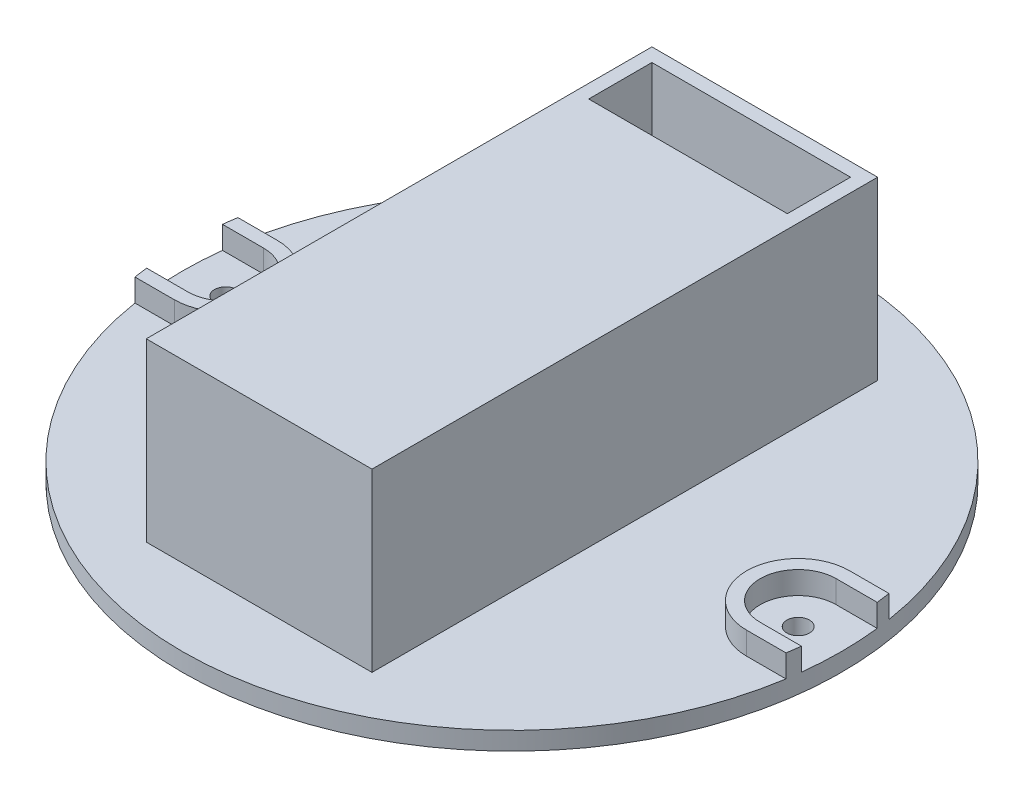
ISO-10303-21;
HEADER;
FILE_DESCRIPTION(('STEP AP214'),'2;1');
FILE_NAME('part.step','',(''),(''),'','','');
FILE_SCHEMA(('AUTOMOTIVE_DESIGN { 1 0 10303 214 1 1 1 1 }'));
ENDSEC;
DATA;
#1=APPLICATION_CONTEXT('core data for automotive mechanical design processes');
#2=APPLICATION_PROTOCOL_DEFINITION('international standard','automotive_design',2000,#1);
#3=PRODUCT_CONTEXT('',#1,'mechanical');
#4=PRODUCT('Part','Part','',(#3));
#5=PRODUCT_RELATED_PRODUCT_CATEGORY('part','',(#4));
#6=PRODUCT_DEFINITION_FORMATION('','',#4);
#7=PRODUCT_DEFINITION_CONTEXT('part definition',#1,'design');
#8=PRODUCT_DEFINITION('design','',#6,#7);
#9=PRODUCT_DEFINITION_SHAPE('','',#8);
#10=(LENGTH_UNIT() NAMED_UNIT(*) SI_UNIT(.MILLI.,.METRE.));
#11=(NAMED_UNIT(*) PLANE_ANGLE_UNIT() SI_UNIT($,.RADIAN.));
#12=(NAMED_UNIT(*) SI_UNIT($,.STERADIAN.) SOLID_ANGLE_UNIT());
#13=UNCERTAINTY_MEASURE_WITH_UNIT(LENGTH_MEASURE(1.E-05),#10,'distance_accuracy_value','');
#14=(GEOMETRIC_REPRESENTATION_CONTEXT(3) GLOBAL_UNCERTAINTY_ASSIGNED_CONTEXT((#13)) GLOBAL_UNIT_ASSIGNED_CONTEXT((#10,
#11,#12)) REPRESENTATION_CONTEXT('',''));
#15=CARTESIAN_POINT('',(0.,0.,0.));
#16=DIRECTION('',(0.,0.,1.));
#17=DIRECTION('',(1.,0.,0.));
#18=AXIS2_PLACEMENT_3D('',#15,#16,#17);
#19=CARTESIAN_POINT('',(0.,-70.5,-26.5));
#20=DIRECTION('',(0.,0.,-1.));
#21=DIRECTION('',(-1.,0.,0.));
#22=AXIS2_PLACEMENT_3D('',#19,#20,#21);
#23=PLANE('',#22);
#24=DIRECTION('',(0.,-1.,0.));
#25=VECTOR('',#24,1.);
#26=CARTESIAN_POINT('',(11.,-70.5,-26.5));
#27=LINE('',#26,#25);
#28=CARTESIAN_POINT('',(11.,-70.5,-26.5));
#29=VERTEX_POINT('',#28);
#30=CARTESIAN_POINT('',(11.,-92.,-26.5));
#31=VERTEX_POINT('',#30);
#32=EDGE_CURVE('E209',#29,#31,#27,.T.);
#33=ORIENTED_EDGE('',*,*,#32,.F.);
#34=DIRECTION('',(1.,0.,0.));
#35=VECTOR('',#34,1.);
#36=CARTESIAN_POINT('',(-11.,-70.5,-26.5));
#37=LINE('',#36,#35);
#38=CARTESIAN_POINT('',(-11.,-70.5,-26.5));
#39=VERTEX_POINT('',#38);
#40=EDGE_CURVE('E211',#39,#29,#37,.T.);
#41=ORIENTED_EDGE('',*,*,#40,.F.);
#42=DIRECTION('',(0.,-1.,0.));
#43=VECTOR('',#42,1.);
#44=CARTESIAN_POINT('',(-11.,-70.5,-26.5));
#45=LINE('',#44,#43);
#46=CARTESIAN_POINT('',(-11.,-92.,-26.5));
#47=VERTEX_POINT('',#46);
#48=EDGE_CURVE('E217',#39,#47,#45,.T.);
#49=ORIENTED_EDGE('',*,*,#48,.T.);
#50=DIRECTION('',(1.,0.,0.));
#51=VECTOR('',#50,1.);
#52=CARTESIAN_POINT('',(-11.,-92.,-26.5));
#53=LINE('',#52,#51);
#54=EDGE_CURVE('E214',#47,#31,#53,.T.);
#55=ORIENTED_EDGE('',*,*,#54,.T.);
#56=EDGE_LOOP('',(#33,#41,#49,#55));
#57=FACE_BOUND('',#56,.T.);
#58=ADVANCED_FACE('F35',(#57),#23,.F.);
#59=CARTESIAN_POINT('',(-11.,-70.5,0.));
#60=DIRECTION('',(-1.,0.,0.));
#61=DIRECTION('',(0.,0.,1.));
#62=AXIS2_PLACEMENT_3D('',#59,#60,#61);
#63=PLANE('',#62);
#64=ORIENTED_EDGE('',*,*,#48,.F.);
#65=DIRECTION('',(0.,0.,-1.));
#66=VECTOR('',#65,1.);
#67=CARTESIAN_POINT('',(-11.,-70.5,-26.5));
#68=LINE('',#67,#66);
#69=CARTESIAN_POINT('',(-11.,-70.5,-19.5));
#70=VERTEX_POINT('',#69);
#71=EDGE_CURVE('E230',#70,#39,#68,.T.);
#72=ORIENTED_EDGE('',*,*,#71,.F.);
#73=DIRECTION('',(0.,-1.,0.));
#74=VECTOR('',#73,1.);
#75=CARTESIAN_POINT('',(-11.,25.501,-19.5));
#76=LINE('',#75,#74);
#77=CARTESIAN_POINT('',(-11.,-72.,-19.5));
#78=VERTEX_POINT('',#77);
#79=EDGE_CURVE('E226',#70,#78,#76,.T.);
#80=ORIENTED_EDGE('',*,*,#79,.T.);
#81=DIRECTION('',(0.,0.,1.));
#82=VECTOR('',#81,1.);
#83=CARTESIAN_POINT('',(-11.,-72.,0.));
#84=LINE('',#83,#82);
#85=CARTESIAN_POINT('',(-11.,-72.,26.5));
#86=VERTEX_POINT('',#85);
#87=EDGE_CURVE('E248',#78,#86,#84,.T.);
#88=ORIENTED_EDGE('',*,*,#87,.T.);
#89=DIRECTION('',(0.,-1.,0.));
#90=VECTOR('',#89,1.);
#91=CARTESIAN_POINT('',(-11.,-70.5,26.5));
#92=LINE('',#91,#90);
#93=CARTESIAN_POINT('',(-11.,-92.,26.5));
#94=VERTEX_POINT('',#93);
#95=EDGE_CURVE('E288',#86,#94,#92,.T.);
#96=ORIENTED_EDGE('',*,*,#95,.T.);
#97=DIRECTION('',(0.,0.,-1.));
#98=VECTOR('',#97,1.);
#99=CARTESIAN_POINT('',(-11.,-92.,26.5));
#100=LINE('',#99,#98);
#101=EDGE_CURVE('E245',#94,#47,#100,.T.);
#102=ORIENTED_EDGE('',*,*,#101,.T.);
#103=EDGE_LOOP('',(#64,#72,#80,#88,#96,#102));
#104=FACE_BOUND('',#103,.T.);
#105=ADVANCED_FACE('F485',(#104),#63,.F.);
#106=CARTESIAN_POINT('',(0.,-70.5,26.5));
#107=DIRECTION('',(0.,0.,-1.));
#108=DIRECTION('',(-1.,0.,0.));
#109=AXIS2_PLACEMENT_3D('',#106,#107,#108);
#110=PLANE('',#109);
#111=DIRECTION('',(-1.,0.,0.));
#112=VECTOR('',#111,1.);
#113=CARTESIAN_POINT('',(0.,-72.,26.5));
#114=LINE('',#113,#112);
#115=CARTESIAN_POINT('',(11.,-72.,26.5));
#116=VERTEX_POINT('',#115);
#117=EDGE_CURVE('E250',#116,#86,#114,.T.);
#118=ORIENTED_EDGE('',*,*,#117,.F.);
#119=DIRECTION('',(0.,-1.,0.));
#120=VECTOR('',#119,1.);
#121=CARTESIAN_POINT('',(11.,-70.5,26.5));
#122=LINE('',#121,#120);
#123=CARTESIAN_POINT('',(11.,-92.,26.5));
#124=VERTEX_POINT('',#123);
#125=EDGE_CURVE('E280',#116,#124,#122,.T.);
#126=ORIENTED_EDGE('',*,*,#125,.T.);
#127=DIRECTION('',(1.,0.,0.));
#128=VECTOR('',#127,1.);
#129=CARTESIAN_POINT('',(-11.,-92.,26.5));
#130=LINE('',#129,#128);
#131=EDGE_CURVE('E225',#94,#124,#130,.T.);
#132=ORIENTED_EDGE('',*,*,#131,.F.);
#133=ORIENTED_EDGE('',*,*,#95,.F.);
#134=EDGE_LOOP('',(#118,#126,#132,#133));
#135=FACE_BOUND('',#134,.T.);
#136=ADVANCED_FACE('F490',(#135),#110,.T.);
#137=CARTESIAN_POINT('',(11.,-70.5,0.));
#138=DIRECTION('',(-1.,0.,0.));
#139=DIRECTION('',(0.,0.,1.));
#140=AXIS2_PLACEMENT_3D('',#137,#138,#139);
#141=PLANE('',#140);
#142=DIRECTION('',(0.,0.,1.));
#143=VECTOR('',#142,1.);
#144=CARTESIAN_POINT('',(11.,-72.,0.));
#145=LINE('',#144,#143);
#146=CARTESIAN_POINT('',(11.,-72.,-19.5));
#147=VERTEX_POINT('',#146);
#148=EDGE_CURVE('E253',#147,#116,#145,.T.);
#149=ORIENTED_EDGE('',*,*,#148,.F.);
#150=DIRECTION('',(0.,-1.,0.));
#151=VECTOR('',#150,1.);
#152=CARTESIAN_POINT('',(11.,25.501,-19.5));
#153=LINE('',#152,#151);
#154=CARTESIAN_POINT('',(11.,-70.5,-19.5));
#155=VERTEX_POINT('',#154);
#156=EDGE_CURVE('E51',#155,#147,#153,.T.);
#157=ORIENTED_EDGE('',*,*,#156,.F.);
#158=DIRECTION('',(0.,0.,1.));
#159=VECTOR('',#158,1.);
#160=CARTESIAN_POINT('',(11.,-70.5,-26.5));
#161=LINE('',#160,#159);
#162=EDGE_CURVE('E221',#29,#155,#161,.T.);
#163=ORIENTED_EDGE('',*,*,#162,.F.);
#164=ORIENTED_EDGE('',*,*,#32,.T.);
#165=DIRECTION('',(0.,0.,-1.));
#166=VECTOR('',#165,1.);
#167=CARTESIAN_POINT('',(11.,-92.,26.5));
#168=LINE('',#167,#166);
#169=EDGE_CURVE('E242',#124,#31,#168,.T.);
#170=ORIENTED_EDGE('',*,*,#169,.F.);
#171=ORIENTED_EDGE('',*,*,#125,.F.);
#172=EDGE_LOOP('',(#149,#157,#163,#164,#170,#171));
#173=FACE_BOUND('',#172,.T.);
#174=ADVANCED_FACE('F222',(#173),#141,.T.);
#175=CARTESIAN_POINT('',(0.,-72.,0.));
#176=DIRECTION('',(0.,-1.,0.));
#177=DIRECTION('',(0.,0.,-1.));
#178=AXIS2_PLACEMENT_3D('',#175,#176,#177);
#179=PLANE('',#178);
#180=DIRECTION('',(-1.,0.,0.));
#181=VECTOR('',#180,1.);
#182=CARTESIAN_POINT('',(11.,-72.,-19.5));
#183=LINE('',#182,#181);
#184=EDGE_CURVE('E231',#147,#78,#183,.T.);
#185=ORIENTED_EDGE('',*,*,#184,.F.);
#186=ORIENTED_EDGE('',*,*,#148,.T.);
#187=ORIENTED_EDGE('',*,*,#117,.T.);
#188=ORIENTED_EDGE('',*,*,#87,.F.);
#189=EDGE_LOOP('',(#185,#186,#187,#188));
#190=FACE_BOUND('',#189,.T.);
#191=ADVANCED_FACE('F502',(#190),#179,.T.);
#192=CARTESIAN_POINT('',(0.,-90.,0.));
#193=DIRECTION('',(0.,1.,0.));
#194=DIRECTION('',(0.,0.,1.));
#195=AXIS2_PLACEMENT_3D('',#192,#193,#194);
#196=PLANE('',#195);
#197=DIRECTION('',(0.,0.,-1.));
#198=VECTOR('',#197,1.);
#199=CARTESIAN_POINT('',(-12.5,-90.,0.));
#200=LINE('',#199,#198);
#201=CARTESIAN_POINT('',(-12.5,-90.,28.));
#202=VERTEX_POINT('',#201);
#203=CARTESIAN_POINT('',(-12.5,-90.,-28.));
#204=VERTEX_POINT('',#203);
#205=EDGE_CURVE('E255',#202,#204,#200,.T.);
#206=ORIENTED_EDGE('',*,*,#205,.T.);
#207=DIRECTION('',(1.,0.,0.));
#208=VECTOR('',#207,1.);
#209=CARTESIAN_POINT('',(0.,-90.,-28.));
#210=LINE('',#209,#208);
#211=CARTESIAN_POINT('',(12.5,-90.,-28.));
#212=VERTEX_POINT('',#211);
#213=EDGE_CURVE('E260',#204,#212,#210,.T.);
#214=ORIENTED_EDGE('',*,*,#213,.T.);
#215=DIRECTION('',(0.,0.,-1.));
#216=VECTOR('',#215,1.);
#217=CARTESIAN_POINT('',(12.5,-90.,0.));
#218=LINE('',#217,#216);
#219=CARTESIAN_POINT('',(12.5,-90.,28.));
#220=VERTEX_POINT('',#219);
#221=EDGE_CURVE('E272',#220,#212,#218,.T.);
#222=ORIENTED_EDGE('',*,*,#221,.F.);
#223=DIRECTION('',(1.,0.,0.));
#224=VECTOR('',#223,1.);
#225=CARTESIAN_POINT('',(0.,-90.,28.));
#226=LINE('',#225,#224);
#227=EDGE_CURVE('E269',#202,#220,#226,.T.);
#228=ORIENTED_EDGE('',*,*,#227,.F.);
#229=EDGE_LOOP('',(#206,#214,#222,#228));
#230=FACE_BOUND('',#229,.T.);
#231=CARTESIAN_POINT('',(31.7,-90.,0.));
#232=DIRECTION('',(0.,1.,0.));
#233=DIRECTION('',(0.,0.,1.));
#234=AXIS2_PLACEMENT_3D('',#231,#232,#233);
#235=CIRCLE('',#234,5.69999999999999);
#236=CARTESIAN_POINT('',(31.7,-90.,-5.7));
#237=VERTEX_POINT('',#236);
#238=CARTESIAN_POINT('',(31.7,-90.,5.69999999999999));
#239=VERTEX_POINT('',#238);
#240=EDGE_CURVE('E313',#237,#239,#235,.T.);
#241=ORIENTED_EDGE('',*,*,#240,.F.);
#242=DIRECTION('',(-1.,0.,0.));
#243=VECTOR('',#242,1.);
#244=CARTESIAN_POINT('',(0.,-90.,-5.69999999999998));
#245=LINE('',#244,#243);
#246=CARTESIAN_POINT('',(36.0521843998391,-90.,-5.69999999999999));
#247=VERTEX_POINT('',#246);
#248=EDGE_CURVE('E285',#247,#237,#245,.T.);
#249=ORIENTED_EDGE('',*,*,#248,.F.);
#250=CARTESIAN_POINT('',(0.,-90.,0.));
#251=DIRECTION('',(0.,1.,0.));
#252=DIRECTION('',(0.,0.,1.));
#253=AXIS2_PLACEMENT_3D('',#250,#251,#252);
#254=CIRCLE('',#253,36.5);
#255=CARTESIAN_POINT('',(-36.0521843998391,-90.,-5.69999999999999));
#256=VERTEX_POINT('',#255);
#257=EDGE_CURVE('E405',#247,#256,#254,.T.);
#258=ORIENTED_EDGE('',*,*,#257,.T.);
#259=DIRECTION('',(1.,0.,0.));
#260=VECTOR('',#259,1.);
#261=CARTESIAN_POINT('',(0.,-90.,-5.70000000000019));
#262=LINE('',#261,#260);
#263=CARTESIAN_POINT('',(-31.7,-90.,-5.70000000000001));
#264=VERTEX_POINT('',#263);
#265=EDGE_CURVE('E374',#256,#264,#262,.T.);
#266=ORIENTED_EDGE('',*,*,#265,.T.);
#267=CARTESIAN_POINT('',(-31.7,-90.,0.));
#268=DIRECTION('',(0.,1.,0.));
#269=DIRECTION('',(0.,0.,1.));
#270=AXIS2_PLACEMENT_3D('',#267,#268,#269);
#271=CIRCLE('',#270,5.70000000000001);
#272=CARTESIAN_POINT('',(-31.7,-90.,5.70000000000001));
#273=VERTEX_POINT('',#272);
#274=EDGE_CURVE('E371',#273,#264,#271,.T.);
#275=ORIENTED_EDGE('',*,*,#274,.F.);
#276=DIRECTION('',(1.,0.,0.));
#277=VECTOR('',#276,1.);
#278=CARTESIAN_POINT('',(0.,-90.,5.70000000000001));
#279=LINE('',#278,#277);
#280=CARTESIAN_POINT('',(-36.0521843998391,-90.,5.70000000000001));
#281=VERTEX_POINT('',#280);
#282=EDGE_CURVE('E348',#281,#273,#279,.T.);
#283=ORIENTED_EDGE('',*,*,#282,.F.);
#284=CARTESIAN_POINT('',(36.0521843998391,-90.,5.7));
#285=VERTEX_POINT('',#284);
#286=EDGE_CURVE('E39',#281,#285,#254,.T.);
#287=ORIENTED_EDGE('',*,*,#286,.T.);
#288=DIRECTION('',(-1.,0.,0.));
#289=VECTOR('',#288,1.);
#290=CARTESIAN_POINT('',(0.,-90.,5.69999999999994));
#291=LINE('',#290,#289);
#292=EDGE_CURVE('E316',#285,#239,#291,.T.);
#293=ORIENTED_EDGE('',*,*,#292,.T.);
#294=EDGE_LOOP('',(#241,#249,#258,#266,#275,#283,#287,#293));
#295=FACE_BOUND('',#294,.T.);
#296=ADVANCED_FACE('F439',(#230,#295),#196,.T.);
#297=CARTESIAN_POINT('',(31.7,-90.,0.));
#298=DIRECTION('',(0.,1.,0.));
#299=DIRECTION('',(0.,0.,1.));
#300=AXIS2_PLACEMENT_3D('',#297,#298,#299);
#301=CIRCLE('',#300,1.25);
#302=CARTESIAN_POINT('',(31.7,-90.,1.24999999999999));
#303=VERTEX_POINT('',#302);
#304=EDGE_CURVE('E803',#303,#303,#301,.T.);
#305=ORIENTED_EDGE('',*,*,#304,.F.);
#306=EDGE_LOOP('',(#305));
#307=FACE_BOUND('',#306,.T.);
#308=CARTESIAN_POINT('',(31.7,-90.,0.));
#309=DIRECTION('',(0.,1.,0.));
#310=DIRECTION('',(0.,0.,1.));
#311=AXIS2_PLACEMENT_3D('',#308,#309,#310);
#312=CIRCLE('',#311,4.19999999999999);
#313=CARTESIAN_POINT('',(31.7,-90.,-4.19999999999999));
#314=VERTEX_POINT('',#313);
#315=CARTESIAN_POINT('',(31.7,-90.,4.19999999999999));
#316=VERTEX_POINT('',#315);
#317=EDGE_CURVE('E321',#314,#316,#312,.T.);
#318=ORIENTED_EDGE('',*,*,#317,.T.);
#319=DIRECTION('',(-1.,0.,0.));
#320=VECTOR('',#319,1.);
#321=CARTESIAN_POINT('',(0.,-90.,4.19999999999995));
#322=LINE('',#321,#320);
#323=CARTESIAN_POINT('',(36.2575509377012,-90.,4.2));
#324=VERTEX_POINT('',#323);
#325=EDGE_CURVE('E318',#324,#316,#322,.T.);
#326=ORIENTED_EDGE('',*,*,#325,.F.);
#327=CARTESIAN_POINT('',(36.2575509377012,-90.,-4.19999999999999));
#328=VERTEX_POINT('',#327);
#329=EDGE_CURVE('E408',#324,#328,#254,.T.);
#330=ORIENTED_EDGE('',*,*,#329,.T.);
#331=DIRECTION('',(-1.,0.,0.));
#332=VECTOR('',#331,1.);
#333=CARTESIAN_POINT('',(0.,-90.,-4.19999999999999));
#334=LINE('',#333,#332);
#335=EDGE_CURVE('E295',#328,#314,#334,.T.);
#336=ORIENTED_EDGE('',*,*,#335,.T.);
#337=EDGE_LOOP('',(#318,#326,#330,#336));
#338=FACE_BOUND('',#337,.T.);
#339=ADVANCED_FACE('F469',(#307,#338),#196,.T.);
#340=CARTESIAN_POINT('',(-31.7,-90.,0.));
#341=DIRECTION('',(0.,1.,0.));
#342=DIRECTION('',(0.,0.,1.));
#343=AXIS2_PLACEMENT_3D('',#340,#341,#342);
#344=CIRCLE('',#343,1.24999999999999);
#345=CARTESIAN_POINT('',(-31.7,-90.,1.24999999999999));
#346=VERTEX_POINT('',#345);
#347=EDGE_CURVE('E795',#346,#346,#344,.T.);
#348=ORIENTED_EDGE('',*,*,#347,.F.);
#349=EDGE_LOOP('',(#348));
#350=FACE_BOUND('',#349,.T.);
#351=CARTESIAN_POINT('',(-36.2575509377012,-90.,-4.20000000000001));
#352=VERTEX_POINT('',#351);
#353=CARTESIAN_POINT('',(-36.2575509377012,-90.,4.2));
#354=VERTEX_POINT('',#353);
#355=EDGE_CURVE('E44',#352,#354,#254,.T.);
#356=ORIENTED_EDGE('',*,*,#355,.T.);
#357=DIRECTION('',(1.,0.,0.));
#358=VECTOR('',#357,1.);
#359=CARTESIAN_POINT('',(0.,-90.,4.2));
#360=LINE('',#359,#358);
#361=CARTESIAN_POINT('',(-31.7,-90.,4.2));
#362=VERTEX_POINT('',#361);
#363=EDGE_CURVE('E353',#354,#362,#360,.T.);
#364=ORIENTED_EDGE('',*,*,#363,.T.);
#365=CARTESIAN_POINT('',(-31.7,-90.,0.));
#366=DIRECTION('',(0.,1.,0.));
#367=DIRECTION('',(0.,0.,1.));
#368=AXIS2_PLACEMENT_3D('',#365,#366,#367);
#369=CIRCLE('',#368,4.2);
#370=CARTESIAN_POINT('',(-31.7,-90.,-4.20000000000001));
#371=VERTEX_POINT('',#370);
#372=EDGE_CURVE('E379',#362,#371,#369,.T.);
#373=ORIENTED_EDGE('',*,*,#372,.T.);
#374=DIRECTION('',(1.,0.,0.));
#375=VECTOR('',#374,1.);
#376=CARTESIAN_POINT('',(0.,-90.,-4.2));
#377=LINE('',#376,#375);
#378=EDGE_CURVE('E376',#352,#371,#377,.T.);
#379=ORIENTED_EDGE('',*,*,#378,.F.);
#380=EDGE_LOOP('',(#356,#364,#373,#379));
#381=FACE_BOUND('',#380,.T.);
#382=ADVANCED_FACE('F414',(#350,#381),#196,.T.);
#383=CARTESIAN_POINT('',(0.,-92.,0.));
#384=DIRECTION('',(0.,1.,0.));
#385=DIRECTION('',(0.,0.,1.));
#386=AXIS2_PLACEMENT_3D('',#383,#384,#385);
#387=CYLINDRICAL_SURFACE('',#386,36.5);
#388=CARTESIAN_POINT('',(0.,-92.,0.));
#389=DIRECTION('',(0.,1.,0.));
#390=DIRECTION('',(0.,0.,1.));
#391=AXIS2_PLACEMENT_3D('',#388,#389,#390);
#392=CIRCLE('',#391,36.5);
#393=CARTESIAN_POINT('',(0.,-92.,36.5));
#394=VERTEX_POINT('',#393);
#395=EDGE_CURVE('E11',#394,#394,#392,.T.);
#396=ORIENTED_EDGE('',*,*,#395,.T.);
#397=EDGE_LOOP('',(#396));
#398=FACE_BOUND('',#397,.T.);
#399=ORIENTED_EDGE('',*,*,#355,.F.);
#400=DIRECTION('',(0.,-1.,0.));
#401=VECTOR('',#400,1.);
#402=CARTESIAN_POINT('',(-36.2575509377012,-87.5,-4.20000000000001));
#403=LINE('',#402,#401);
#404=CARTESIAN_POINT('',(-36.2575509377012,-87.5,-4.20000000000001));
#405=VERTEX_POINT('',#404);
#406=EDGE_CURVE('E394',#405,#352,#403,.T.);
#407=ORIENTED_EDGE('',*,*,#406,.F.);
#408=CARTESIAN_POINT('',(0.,-87.5,0.));
#409=DIRECTION('',(0.,1.,0.));
#410=DIRECTION('',(0.,0.,1.));
#411=AXIS2_PLACEMENT_3D('',#408,#409,#410);
#412=CIRCLE('',#411,36.5);
#413=CARTESIAN_POINT('',(-36.0521843998391,-87.5,-5.69999999999999));
#414=VERTEX_POINT('',#413);
#415=EDGE_CURVE('E358',#414,#405,#412,.T.);
#416=ORIENTED_EDGE('',*,*,#415,.F.);
#417=DIRECTION('',(0.,-1.,0.));
#418=VECTOR('',#417,1.);
#419=CARTESIAN_POINT('',(-36.0521843998391,-87.5,-5.69999999999999));
#420=LINE('',#419,#418);
#421=EDGE_CURVE('E397',#414,#256,#420,.T.);
#422=ORIENTED_EDGE('',*,*,#421,.T.);
#423=ORIENTED_EDGE('',*,*,#257,.F.);
#424=DIRECTION('',(0.,-1.,0.));
#425=VECTOR('',#424,1.);
#426=CARTESIAN_POINT('',(36.0521843998391,-87.5,-5.69999999999999));
#427=LINE('',#426,#425);
#428=CARTESIAN_POINT('',(36.0521843998391,-87.5,-5.69999999999999));
#429=VERTEX_POINT('',#428);
#430=EDGE_CURVE('E324',#429,#247,#427,.T.);
#431=ORIENTED_EDGE('',*,*,#430,.F.);
#432=CARTESIAN_POINT('',(0.,-87.5,0.));
#433=DIRECTION('',(0.,1.,0.));
#434=DIRECTION('',(0.,0.,1.));
#435=AXIS2_PLACEMENT_3D('',#432,#433,#434);
#436=CIRCLE('',#435,36.5);
#437=CARTESIAN_POINT('',(36.2575509377012,-87.5,-4.19999999999999));
#438=VERTEX_POINT('',#437);
#439=EDGE_CURVE('E303',#438,#429,#436,.T.);
#440=ORIENTED_EDGE('',*,*,#439,.F.);
#441=DIRECTION('',(0.,-1.,0.));
#442=VECTOR('',#441,1.);
#443=CARTESIAN_POINT('',(36.2575509377012,-87.5,-4.19999999999999));
#444=LINE('',#443,#442);
#445=EDGE_CURVE('E327',#438,#328,#444,.T.);
#446=ORIENTED_EDGE('',*,*,#445,.T.);
#447=ORIENTED_EDGE('',*,*,#329,.F.);
#448=DIRECTION('',(0.,-1.,0.));
#449=VECTOR('',#448,1.);
#450=CARTESIAN_POINT('',(36.2575509377012,-87.5,4.2));
#451=LINE('',#450,#449);
#452=CARTESIAN_POINT('',(36.2575509377012,-87.5,4.2));
#453=VERTEX_POINT('',#452);
#454=EDGE_CURVE('E336',#453,#324,#451,.T.);
#455=ORIENTED_EDGE('',*,*,#454,.F.);
#456=CARTESIAN_POINT('',(36.0521843998391,-87.5,5.7));
#457=VERTEX_POINT('',#456);
#458=EDGE_CURVE('E300',#457,#453,#436,.T.);
#459=ORIENTED_EDGE('',*,*,#458,.F.);
#460=DIRECTION('',(0.,-1.,0.));
#461=VECTOR('',#460,1.);
#462=CARTESIAN_POINT('',(36.0521843998391,-87.5,5.7));
#463=LINE('',#462,#461);
#464=EDGE_CURVE('E339',#457,#285,#463,.T.);
#465=ORIENTED_EDGE('',*,*,#464,.T.);
#466=ORIENTED_EDGE('',*,*,#286,.F.);
#467=DIRECTION('',(0.,-1.,0.));
#468=VECTOR('',#467,1.);
#469=CARTESIAN_POINT('',(-36.0521843998391,-87.5,5.70000000000001));
#470=LINE('',#469,#468);
#471=CARTESIAN_POINT('',(-36.0521843998391,-87.5,5.70000000000001));
#472=VERTEX_POINT('',#471);
#473=EDGE_CURVE('E382',#472,#281,#470,.T.);
#474=ORIENTED_EDGE('',*,*,#473,.F.);
#475=CARTESIAN_POINT('',(-36.2575509377012,-87.5,4.2));
#476=VERTEX_POINT('',#475);
#477=EDGE_CURVE('E361',#476,#472,#412,.T.);
#478=ORIENTED_EDGE('',*,*,#477,.F.);
#479=DIRECTION('',(0.,-1.,0.));
#480=VECTOR('',#479,1.);
#481=CARTESIAN_POINT('',(-36.2575509377012,-87.5,4.2));
#482=LINE('',#481,#480);
#483=EDGE_CURVE('E385',#476,#354,#482,.T.);
#484=ORIENTED_EDGE('',*,*,#483,.T.);
#485=EDGE_LOOP('',(#399,#407,#416,#422,#423,#431,#440,#446,#447,#455,#459,#465,#466,#474,#478,#484));
#486=FACE_BOUND('',#485,.T.);
#487=ADVANCED_FACE('F37',(#398,#486),#387,.T.);
#488=CARTESIAN_POINT('',(0.,-92.,0.));
#489=DIRECTION('',(0.,1.,0.));
#490=DIRECTION('',(0.,0.,1.));
#491=AXIS2_PLACEMENT_3D('',#488,#489,#490);
#492=PLANE('',#491);
#493=CARTESIAN_POINT('',(31.7,-92.,0.));
#494=DIRECTION('',(0.,1.,0.));
#495=DIRECTION('',(0.,0.,1.));
#496=AXIS2_PLACEMENT_3D('',#493,#494,#495);
#497=CIRCLE('',#496,1.25);
#498=CARTESIAN_POINT('',(31.7,-92.,1.24999999999999));
#499=VERTEX_POINT('',#498);
#500=EDGE_CURVE('E800',#499,#499,#497,.F.);
#501=ORIENTED_EDGE('',*,*,#500,.F.);
#502=EDGE_LOOP('',(#501));
#503=FACE_BOUND('',#502,.T.);
#504=CARTESIAN_POINT('',(-31.7,-92.,0.));
#505=DIRECTION('',(0.,1.,0.));
#506=DIRECTION('',(0.,0.,1.));
#507=AXIS2_PLACEMENT_3D('',#504,#505,#506);
#508=CIRCLE('',#507,1.24999999999999);
#509=CARTESIAN_POINT('',(-31.7,-92.,1.24999999999999));
#510=VERTEX_POINT('',#509);
#511=EDGE_CURVE('E793',#510,#510,#508,.F.);
#512=ORIENTED_EDGE('',*,*,#511,.F.);
#513=EDGE_LOOP('',(#512));
#514=FACE_BOUND('',#513,.T.);
#515=ORIENTED_EDGE('',*,*,#101,.F.);
#516=ORIENTED_EDGE('',*,*,#131,.T.);
#517=ORIENTED_EDGE('',*,*,#169,.T.);
#518=ORIENTED_EDGE('',*,*,#54,.F.);
#519=EDGE_LOOP('',(#515,#516,#517,#518));
#520=FACE_BOUND('',#519,.T.);
#521=ORIENTED_EDGE('',*,*,#395,.F.);
#522=EDGE_LOOP('',(#521));
#523=FACE_BOUND('',#522,.T.);
#524=ADVANCED_FACE('F592',(#503,#514,#520,#523),#492,.F.);
#525=CARTESIAN_POINT('',(0.,-87.5,5.70000000000001));
#526=DIRECTION('',(0.,0.,-1.));
#527=DIRECTION('',(-1.,0.,0.));
#528=AXIS2_PLACEMENT_3D('',#525,#526,#527);
#529=PLANE('',#528);
#530=ORIENTED_EDGE('',*,*,#282,.T.);
#531=DIRECTION('',(0.,-1.,0.));
#532=VECTOR('',#531,1.);
#533=CARTESIAN_POINT('',(-31.7,-87.5,5.70000000000001));
#534=LINE('',#533,#532);
#535=CARTESIAN_POINT('',(-31.7,-87.5,5.70000000000001));
#536=VERTEX_POINT('',#535);
#537=EDGE_CURVE('E403',#536,#273,#534,.T.);
#538=ORIENTED_EDGE('',*,*,#537,.F.);
#539=DIRECTION('',(1.,0.,0.));
#540=VECTOR('',#539,1.);
#541=CARTESIAN_POINT('',(0.,-87.5,5.70000000000001));
#542=LINE('',#541,#540);
#543=EDGE_CURVE('E349',#472,#536,#542,.T.);
#544=ORIENTED_EDGE('',*,*,#543,.F.);
#545=ORIENTED_EDGE('',*,*,#473,.T.);
#546=EDGE_LOOP('',(#530,#538,#544,#545));
#547=FACE_BOUND('',#546,.T.);
#548=ADVANCED_FACE('F443',(#547),#529,.F.);
#549=CARTESIAN_POINT('',(-31.7,-87.5,0.));
#550=DIRECTION('',(0.,-1.,0.));
#551=DIRECTION('',(0.,0.,-1.));
#552=AXIS2_PLACEMENT_3D('',#549,#550,#551);
#553=CYLINDRICAL_SURFACE('',#552,5.70000000000001);
#554=ORIENTED_EDGE('',*,*,#274,.T.);
#555=DIRECTION('',(0.,-1.,0.));
#556=VECTOR('',#555,1.);
#557=CARTESIAN_POINT('',(-31.7,-87.5,-5.70000000000001));
#558=LINE('',#557,#556);
#559=CARTESIAN_POINT('',(-31.7,-87.5,-5.70000000000001));
#560=VERTEX_POINT('',#559);
#561=EDGE_CURVE('E400',#560,#264,#558,.T.);
#562=ORIENTED_EDGE('',*,*,#561,.F.);
#563=CARTESIAN_POINT('',(-31.7,-87.5,0.));
#564=DIRECTION('',(0.,1.,0.));
#565=DIRECTION('',(0.,0.,1.));
#566=AXIS2_PLACEMENT_3D('',#563,#564,#565);
#567=CIRCLE('',#566,5.70000000000001);
#568=EDGE_CURVE('E352',#536,#560,#567,.T.);
#569=ORIENTED_EDGE('',*,*,#568,.F.);
#570=ORIENTED_EDGE('',*,*,#537,.T.);
#571=EDGE_LOOP('',(#554,#562,#569,#570));
#572=FACE_BOUND('',#571,.T.);
#573=ADVANCED_FACE('F440',(#572),#553,.T.);
#574=CARTESIAN_POINT('',(0.,-87.5,-5.70000000000019));
#575=DIRECTION('',(0.,0.,-1.));
#576=DIRECTION('',(-1.,0.,0.));
#577=AXIS2_PLACEMENT_3D('',#574,#575,#576);
#578=PLANE('',#577);
#579=ORIENTED_EDGE('',*,*,#265,.F.);
#580=ORIENTED_EDGE('',*,*,#421,.F.);
#581=DIRECTION('',(1.,0.,0.));
#582=VECTOR('',#581,1.);
#583=CARTESIAN_POINT('',(0.,-87.5,-5.70000000000019));
#584=LINE('',#583,#582);
#585=EDGE_CURVE('E355',#414,#560,#584,.T.);
#586=ORIENTED_EDGE('',*,*,#585,.T.);
#587=ORIENTED_EDGE('',*,*,#561,.T.);
#588=EDGE_LOOP('',(#579,#580,#586,#587));
#589=FACE_BOUND('',#588,.T.);
#590=ADVANCED_FACE('F438',(#589),#578,.T.);
#591=CARTESIAN_POINT('',(0.,-87.5,-4.2));
#592=DIRECTION('',(0.,0.,-1.));
#593=DIRECTION('',(-1.,0.,0.));
#594=AXIS2_PLACEMENT_3D('',#591,#592,#593);
#595=PLANE('',#594);
#596=ORIENTED_EDGE('',*,*,#378,.T.);
#597=DIRECTION('',(0.,-1.,0.));
#598=VECTOR('',#597,1.);
#599=CARTESIAN_POINT('',(-31.7,-87.5,-4.20000000000001));
#600=LINE('',#599,#598);
#601=CARTESIAN_POINT('',(-31.7,-87.5,-4.20000000000001));
#602=VERTEX_POINT('',#601);
#603=EDGE_CURVE('E391',#602,#371,#600,.T.);
#604=ORIENTED_EDGE('',*,*,#603,.F.);
#605=DIRECTION('',(1.,0.,0.));
#606=VECTOR('',#605,1.);
#607=CARTESIAN_POINT('',(0.,-87.5,-4.2));
#608=LINE('',#607,#606);
#609=EDGE_CURVE('E360',#405,#602,#608,.T.);
#610=ORIENTED_EDGE('',*,*,#609,.F.);
#611=ORIENTED_EDGE('',*,*,#406,.T.);
#612=EDGE_LOOP('',(#596,#604,#610,#611));
#613=FACE_BOUND('',#612,.T.);
#614=ADVANCED_FACE('F430',(#613),#595,.F.);
#615=CARTESIAN_POINT('',(-31.7,-87.5,0.));
#616=DIRECTION('',(0.,-1.,0.));
#617=DIRECTION('',(0.,0.,-1.));
#618=AXIS2_PLACEMENT_3D('',#615,#616,#617);
#619=CYLINDRICAL_SURFACE('',#618,4.2);
#620=ORIENTED_EDGE('',*,*,#372,.F.);
#621=DIRECTION('',(0.,-1.,0.));
#622=VECTOR('',#621,1.);
#623=CARTESIAN_POINT('',(-31.7,-87.5,4.2));
#624=LINE('',#623,#622);
#625=CARTESIAN_POINT('',(-31.7,-87.5,4.2));
#626=VERTEX_POINT('',#625);
#627=EDGE_CURVE('E388',#626,#362,#624,.T.);
#628=ORIENTED_EDGE('',*,*,#627,.F.);
#629=CARTESIAN_POINT('',(-31.7,-87.5,0.));
#630=DIRECTION('',(0.,1.,0.));
#631=DIRECTION('',(0.,0.,1.));
#632=AXIS2_PLACEMENT_3D('',#629,#630,#631);
#633=CIRCLE('',#632,4.2);
#634=EDGE_CURVE('E363',#626,#602,#633,.T.);
#635=ORIENTED_EDGE('',*,*,#634,.T.);
#636=ORIENTED_EDGE('',*,*,#603,.T.);
#637=EDGE_LOOP('',(#620,#628,#635,#636));
#638=FACE_BOUND('',#637,.T.);
#639=ADVANCED_FACE('F426',(#638),#619,.F.);
#640=CARTESIAN_POINT('',(0.,-87.5,4.2));
#641=DIRECTION('',(0.,0.,-1.));
#642=DIRECTION('',(-1.,0.,0.));
#643=AXIS2_PLACEMENT_3D('',#640,#641,#642);
#644=PLANE('',#643);
#645=ORIENTED_EDGE('',*,*,#363,.F.);
#646=ORIENTED_EDGE('',*,*,#483,.F.);
#647=DIRECTION('',(1.,0.,0.));
#648=VECTOR('',#647,1.);
#649=CARTESIAN_POINT('',(0.,-87.5,4.2));
#650=LINE('',#649,#648);
#651=EDGE_CURVE('E366',#476,#626,#650,.T.);
#652=ORIENTED_EDGE('',*,*,#651,.T.);
#653=ORIENTED_EDGE('',*,*,#627,.T.);
#654=EDGE_LOOP('',(#645,#646,#652,#653));
#655=FACE_BOUND('',#654,.T.);
#656=ADVANCED_FACE('F422',(#655),#644,.T.);
#657=CARTESIAN_POINT('',(0.,-87.5,0.));
#658=DIRECTION('',(0.,1.,0.));
#659=DIRECTION('',(0.,0.,1.));
#660=AXIS2_PLACEMENT_3D('',#657,#658,#659);
#661=PLANE('',#660);
#662=ORIENTED_EDGE('',*,*,#543,.T.);
#663=ORIENTED_EDGE('',*,*,#568,.T.);
#664=ORIENTED_EDGE('',*,*,#585,.F.);
#665=ORIENTED_EDGE('',*,*,#415,.T.);
#666=ORIENTED_EDGE('',*,*,#609,.T.);
#667=ORIENTED_EDGE('',*,*,#634,.F.);
#668=ORIENTED_EDGE('',*,*,#651,.F.);
#669=ORIENTED_EDGE('',*,*,#477,.T.);
#670=EDGE_LOOP('',(#662,#663,#664,#665,#666,#667,#668,#669));
#671=FACE_BOUND('',#670,.T.);
#672=ADVANCED_FACE('F435',(#671),#661,.T.);
#673=CARTESIAN_POINT('',(0.,-87.5,-5.69999999999998));
#674=DIRECTION('',(0.,0.,1.));
#675=DIRECTION('',(1.,0.,0.));
#676=AXIS2_PLACEMENT_3D('',#673,#674,#675);
#677=PLANE('',#676);
#678=ORIENTED_EDGE('',*,*,#248,.T.);
#679=DIRECTION('',(0.,-1.,0.));
#680=VECTOR('',#679,1.);
#681=CARTESIAN_POINT('',(31.7,-87.5,-5.69999999999999));
#682=LINE('',#681,#680);
#683=CARTESIAN_POINT('',(31.7,-87.5,-5.69999999999999));
#684=VERTEX_POINT('',#683);
#685=EDGE_CURVE('E345',#684,#237,#682,.T.);
#686=ORIENTED_EDGE('',*,*,#685,.F.);
#687=DIRECTION('',(-1.,0.,0.));
#688=VECTOR('',#687,1.);
#689=CARTESIAN_POINT('',(0.,-87.5,-5.69999999999998));
#690=LINE('',#689,#688);
#691=EDGE_CURVE('E291',#429,#684,#690,.T.);
#692=ORIENTED_EDGE('',*,*,#691,.F.);
#693=ORIENTED_EDGE('',*,*,#430,.T.);
#694=EDGE_LOOP('',(#678,#686,#692,#693));
#695=FACE_BOUND('',#694,.T.);
#696=ADVANCED_FACE('F456',(#695),#677,.F.);
#697=CARTESIAN_POINT('',(31.7,-87.5,0.));
#698=DIRECTION('',(0.,-1.,0.));
#699=DIRECTION('',(0.,0.,-1.));
#700=AXIS2_PLACEMENT_3D('',#697,#698,#699);
#701=CYLINDRICAL_SURFACE('',#700,5.69999999999999);
#702=ORIENTED_EDGE('',*,*,#240,.T.);
#703=DIRECTION('',(0.,-1.,0.));
#704=VECTOR('',#703,1.);
#705=CARTESIAN_POINT('',(31.7,-87.5,5.69999999999999));
#706=LINE('',#705,#704);
#707=CARTESIAN_POINT('',(31.7,-87.5,5.69999999999999));
#708=VERTEX_POINT('',#707);
#709=EDGE_CURVE('E342',#708,#239,#706,.T.);
#710=ORIENTED_EDGE('',*,*,#709,.F.);
#711=CARTESIAN_POINT('',(31.7,-87.5,0.));
#712=DIRECTION('',(0.,1.,0.));
#713=DIRECTION('',(0.,0.,1.));
#714=AXIS2_PLACEMENT_3D('',#711,#712,#713);
#715=CIRCLE('',#714,5.69999999999999);
#716=EDGE_CURVE('E294',#684,#708,#715,.T.);
#717=ORIENTED_EDGE('',*,*,#716,.F.);
#718=ORIENTED_EDGE('',*,*,#685,.T.);
#719=EDGE_LOOP('',(#702,#710,#717,#718));
#720=FACE_BOUND('',#719,.T.);
#721=ADVANCED_FACE('F453',(#720),#701,.T.);
#722=CARTESIAN_POINT('',(0.,-87.5,5.69999999999994));
#723=DIRECTION('',(0.,0.,1.));
#724=DIRECTION('',(1.,0.,0.));
#725=AXIS2_PLACEMENT_3D('',#722,#723,#724);
#726=PLANE('',#725);
#727=ORIENTED_EDGE('',*,*,#292,.F.);
#728=ORIENTED_EDGE('',*,*,#464,.F.);
#729=DIRECTION('',(-1.,0.,0.));
#730=VECTOR('',#729,1.);
#731=CARTESIAN_POINT('',(0.,-87.5,5.69999999999994));
#732=LINE('',#731,#730);
#733=EDGE_CURVE('E297',#457,#708,#732,.T.);
#734=ORIENTED_EDGE('',*,*,#733,.T.);
#735=ORIENTED_EDGE('',*,*,#709,.T.);
#736=EDGE_LOOP('',(#727,#728,#734,#735));
#737=FACE_BOUND('',#736,.T.);
#738=ADVANCED_FACE('F449',(#737),#726,.T.);
#739=CARTESIAN_POINT('',(0.,-87.5,4.19999999999995));
#740=DIRECTION('',(0.,0.,1.));
#741=DIRECTION('',(1.,0.,0.));
#742=AXIS2_PLACEMENT_3D('',#739,#740,#741);
#743=PLANE('',#742);
#744=ORIENTED_EDGE('',*,*,#325,.T.);
#745=DIRECTION('',(0.,-1.,0.));
#746=VECTOR('',#745,1.);
#747=CARTESIAN_POINT('',(31.7,-87.5,4.19999999999999));
#748=LINE('',#747,#746);
#749=CARTESIAN_POINT('',(31.7,-87.5,4.19999999999999));
#750=VERTEX_POINT('',#749);
#751=EDGE_CURVE('E333',#750,#316,#748,.T.);
#752=ORIENTED_EDGE('',*,*,#751,.F.);
#753=DIRECTION('',(-1.,0.,0.));
#754=VECTOR('',#753,1.);
#755=CARTESIAN_POINT('',(0.,-87.5,4.19999999999995));
#756=LINE('',#755,#754);
#757=EDGE_CURVE('E302',#453,#750,#756,.T.);
#758=ORIENTED_EDGE('',*,*,#757,.F.);
#759=ORIENTED_EDGE('',*,*,#454,.T.);
#760=EDGE_LOOP('',(#744,#752,#758,#759));
#761=FACE_BOUND('',#760,.T.);
#762=ADVANCED_FACE('F472',(#761),#743,.F.);
#763=CARTESIAN_POINT('',(31.7,-87.5,0.));
#764=DIRECTION('',(0.,-1.,0.));
#765=DIRECTION('',(0.,0.,-1.));
#766=AXIS2_PLACEMENT_3D('',#763,#764,#765);
#767=CYLINDRICAL_SURFACE('',#766,4.19999999999999);
#768=ORIENTED_EDGE('',*,*,#317,.F.);
#769=DIRECTION('',(0.,-1.,0.));
#770=VECTOR('',#769,1.);
#771=CARTESIAN_POINT('',(31.7,-87.5,-4.19999999999999));
#772=LINE('',#771,#770);
#773=CARTESIAN_POINT('',(31.7,-87.5,-4.19999999999999));
#774=VERTEX_POINT('',#773);
#775=EDGE_CURVE('E330',#774,#314,#772,.T.);
#776=ORIENTED_EDGE('',*,*,#775,.F.);
#777=CARTESIAN_POINT('',(31.7,-87.5,0.));
#778=DIRECTION('',(0.,1.,0.));
#779=DIRECTION('',(0.,0.,1.));
#780=AXIS2_PLACEMENT_3D('',#777,#778,#779);
#781=CIRCLE('',#780,4.19999999999999);
#782=EDGE_CURVE('E305',#774,#750,#781,.T.);
#783=ORIENTED_EDGE('',*,*,#782,.T.);
#784=ORIENTED_EDGE('',*,*,#751,.T.);
#785=EDGE_LOOP('',(#768,#776,#783,#784));
#786=FACE_BOUND('',#785,.T.);
#787=ADVANCED_FACE('F475',(#786),#767,.F.);
#788=CARTESIAN_POINT('',(0.,-87.5,-4.19999999999999));
#789=DIRECTION('',(0.,0.,1.));
#790=DIRECTION('',(1.,0.,0.));
#791=AXIS2_PLACEMENT_3D('',#788,#789,#790);
#792=PLANE('',#791);
#793=ORIENTED_EDGE('',*,*,#335,.F.);
#794=ORIENTED_EDGE('',*,*,#445,.F.);
#795=DIRECTION('',(-1.,0.,0.));
#796=VECTOR('',#795,1.);
#797=CARTESIAN_POINT('',(0.,-87.5,-4.19999999999999));
#798=LINE('',#797,#796);
#799=EDGE_CURVE('E308',#438,#774,#798,.T.);
#800=ORIENTED_EDGE('',*,*,#799,.T.);
#801=ORIENTED_EDGE('',*,*,#775,.T.);
#802=EDGE_LOOP('',(#793,#794,#800,#801));
#803=FACE_BOUND('',#802,.T.);
#804=ADVANCED_FACE('F466',(#803),#792,.T.);
#805=CARTESIAN_POINT('',(0.,-87.5,0.));
#806=DIRECTION('',(0.,1.,0.));
#807=DIRECTION('',(0.,0.,1.));
#808=AXIS2_PLACEMENT_3D('',#805,#806,#807);
#809=PLANE('',#808);
#810=ORIENTED_EDGE('',*,*,#691,.T.);
#811=ORIENTED_EDGE('',*,*,#716,.T.);
#812=ORIENTED_EDGE('',*,*,#733,.F.);
#813=ORIENTED_EDGE('',*,*,#458,.T.);
#814=ORIENTED_EDGE('',*,*,#757,.T.);
#815=ORIENTED_EDGE('',*,*,#782,.F.);
#816=ORIENTED_EDGE('',*,*,#799,.F.);
#817=ORIENTED_EDGE('',*,*,#439,.T.);
#818=EDGE_LOOP('',(#810,#811,#812,#813,#814,#815,#816,#817));
#819=FACE_BOUND('',#818,.T.);
#820=ADVANCED_FACE('F464',(#819),#809,.T.);
#821=CARTESIAN_POINT('',(-12.5,-70.5,0.));
#822=DIRECTION('',(-1.,0.,0.));
#823=DIRECTION('',(0.,0.,1.));
#824=AXIS2_PLACEMENT_3D('',#821,#822,#823);
#825=PLANE('',#824);
#826=ORIENTED_EDGE('',*,*,#205,.F.);
#827=DIRECTION('',(0.,-1.,0.));
#828=VECTOR('',#827,1.);
#829=CARTESIAN_POINT('',(-12.5,-70.5,28.));
#830=LINE('',#829,#828);
#831=CARTESIAN_POINT('',(-12.5,-70.5,28.));
#832=VERTEX_POINT('',#831);
#833=EDGE_CURVE('E284',#832,#202,#830,.T.);
#834=ORIENTED_EDGE('',*,*,#833,.F.);
#835=DIRECTION('',(0.,0.,-1.));
#836=VECTOR('',#835,1.);
#837=CARTESIAN_POINT('',(-12.5,-70.5,0.));
#838=LINE('',#837,#836);
#839=CARTESIAN_POINT('',(-12.5,-70.5,-28.));
#840=VERTEX_POINT('',#839);
#841=EDGE_CURVE('E256',#832,#840,#838,.T.);
#842=ORIENTED_EDGE('',*,*,#841,.T.);
#843=DIRECTION('',(0.,-1.,0.));
#844=VECTOR('',#843,1.);
#845=CARTESIAN_POINT('',(-12.5,-70.5,-28.));
#846=LINE('',#845,#844);
#847=EDGE_CURVE('E277',#840,#204,#846,.T.);
#848=ORIENTED_EDGE('',*,*,#847,.T.);
#849=EDGE_LOOP('',(#826,#834,#842,#848));
#850=FACE_BOUND('',#849,.T.);
#851=ADVANCED_FACE('F494',(#850),#825,.T.);
#852=CARTESIAN_POINT('',(0.,-70.5,28.));
#853=DIRECTION('',(0.,0.,-1.));
#854=DIRECTION('',(-1.,0.,0.));
#855=AXIS2_PLACEMENT_3D('',#852,#853,#854);
#856=PLANE('',#855);
#857=ORIENTED_EDGE('',*,*,#227,.T.);
#858=DIRECTION('',(0.,-1.,0.));
#859=VECTOR('',#858,1.);
#860=CARTESIAN_POINT('',(12.5,-70.5,28.));
#861=LINE('',#860,#859);
#862=CARTESIAN_POINT('',(12.5,-70.5,28.));
#863=VERTEX_POINT('',#862);
#864=EDGE_CURVE('E282',#863,#220,#861,.T.);
#865=ORIENTED_EDGE('',*,*,#864,.F.);
#866=DIRECTION('',(1.,0.,0.));
#867=VECTOR('',#866,1.);
#868=CARTESIAN_POINT('',(0.,-70.5,28.));
#869=LINE('',#868,#867);
#870=EDGE_CURVE('E259',#832,#863,#869,.T.);
#871=ORIENTED_EDGE('',*,*,#870,.F.);
#872=ORIENTED_EDGE('',*,*,#833,.T.);
#873=EDGE_LOOP('',(#857,#865,#871,#872));
#874=FACE_BOUND('',#873,.T.);
#875=ADVANCED_FACE('F507',(#874),#856,.F.);
#876=CARTESIAN_POINT('',(12.5,-70.5,0.));
#877=DIRECTION('',(-1.,0.,0.));
#878=DIRECTION('',(0.,0.,1.));
#879=AXIS2_PLACEMENT_3D('',#876,#877,#878);
#880=PLANE('',#879);
#881=ORIENTED_EDGE('',*,*,#221,.T.);
#882=DIRECTION('',(0.,-1.,0.));
#883=VECTOR('',#882,1.);
#884=CARTESIAN_POINT('',(12.5,-70.5,-28.));
#885=LINE('',#884,#883);
#886=CARTESIAN_POINT('',(12.5,-70.5,-28.));
#887=VERTEX_POINT('',#886);
#888=EDGE_CURVE('E279',#887,#212,#885,.T.);
#889=ORIENTED_EDGE('',*,*,#888,.F.);
#890=DIRECTION('',(0.,0.,-1.));
#891=VECTOR('',#890,1.);
#892=CARTESIAN_POINT('',(12.5,-70.5,0.));
#893=LINE('',#892,#891);
#894=EDGE_CURVE('E263',#863,#887,#893,.T.);
#895=ORIENTED_EDGE('',*,*,#894,.F.);
#896=ORIENTED_EDGE('',*,*,#864,.T.);
#897=EDGE_LOOP('',(#881,#889,#895,#896));
#898=FACE_BOUND('',#897,.T.);
#899=ADVANCED_FACE('F512',(#898),#880,.F.);
#900=CARTESIAN_POINT('',(0.,-70.5,-28.));
#901=DIRECTION('',(0.,0.,-1.));
#902=DIRECTION('',(-1.,0.,0.));
#903=AXIS2_PLACEMENT_3D('',#900,#901,#902);
#904=PLANE('',#903);
#905=ORIENTED_EDGE('',*,*,#213,.F.);
#906=ORIENTED_EDGE('',*,*,#847,.F.);
#907=DIRECTION('',(1.,0.,0.));
#908=VECTOR('',#907,1.);
#909=CARTESIAN_POINT('',(0.,-70.5,-28.));
#910=LINE('',#909,#908);
#911=EDGE_CURVE('E218',#840,#887,#910,.T.);
#912=ORIENTED_EDGE('',*,*,#911,.T.);
#913=ORIENTED_EDGE('',*,*,#888,.T.);
#914=EDGE_LOOP('',(#905,#906,#912,#913));
#915=FACE_BOUND('',#914,.T.);
#916=ADVANCED_FACE('F521',(#915),#904,.T.);
#917=CARTESIAN_POINT('',(0.,-70.5,0.));
#918=DIRECTION('',(0.,1.,0.));
#919=DIRECTION('',(0.,0.,1.));
#920=AXIS2_PLACEMENT_3D('',#917,#918,#919);
#921=PLANE('',#920);
#922=ORIENTED_EDGE('',*,*,#40,.T.);
#923=ORIENTED_EDGE('',*,*,#162,.T.);
#924=DIRECTION('',(-1.,0.,0.));
#925=VECTOR('',#924,1.);
#926=CARTESIAN_POINT('',(11.,-70.5,-19.5));
#927=LINE('',#926,#925);
#928=EDGE_CURVE('E234',#155,#70,#927,.T.);
#929=ORIENTED_EDGE('',*,*,#928,.T.);
#930=ORIENTED_EDGE('',*,*,#71,.T.);
#931=EDGE_LOOP('',(#922,#923,#929,#930));
#932=FACE_BOUND('',#931,.T.);
#933=ORIENTED_EDGE('',*,*,#841,.F.);
#934=ORIENTED_EDGE('',*,*,#870,.T.);
#935=ORIENTED_EDGE('',*,*,#894,.T.);
#936=ORIENTED_EDGE('',*,*,#911,.F.);
#937=EDGE_LOOP('',(#933,#934,#935,#936));
#938=FACE_BOUND('',#937,.T.);
#939=ADVANCED_FACE('F228',(#932,#938),#921,.T.);
#940=CARTESIAN_POINT('',(11.,25.501,-19.5));
#941=DIRECTION('',(0.,0.,1.));
#942=DIRECTION('',(1.,0.,0.));
#943=AXIS2_PLACEMENT_3D('',#940,#941,#942);
#944=PLANE('',#943);
#945=ORIENTED_EDGE('',*,*,#156,.T.);
#946=ORIENTED_EDGE('',*,*,#184,.T.);
#947=ORIENTED_EDGE('',*,*,#79,.F.);
#948=ORIENTED_EDGE('',*,*,#928,.F.);
#949=EDGE_LOOP('',(#945,#946,#947,#948));
#950=FACE_BOUND('',#949,.T.);
#951=ADVANCED_FACE('F528',(#950),#944,.F.);
#952=CARTESIAN_POINT('',(-31.7,-92.001,0.));
#953=DIRECTION('',(0.,1.,0.));
#954=DIRECTION('',(0.,0.,1.));
#955=AXIS2_PLACEMENT_3D('',#952,#953,#954);
#956=CYLINDRICAL_SURFACE('',#955,1.24999999999999);
#957=ORIENTED_EDGE('',*,*,#347,.T.);
#958=EDGE_LOOP('',(#957));
#959=FACE_BOUND('',#958,.T.);
#960=ORIENTED_EDGE('',*,*,#511,.T.);
#961=EDGE_LOOP('',(#960));
#962=FACE_BOUND('',#961,.T.);
#963=ADVANCED_FACE('F534',(#959,#962),#956,.F.);
#964=CARTESIAN_POINT('',(31.7,-92.001,0.));
#965=DIRECTION('',(0.,1.,0.));
#966=DIRECTION('',(0.,0.,1.));
#967=AXIS2_PLACEMENT_3D('',#964,#965,#966);
#968=CYLINDRICAL_SURFACE('',#967,1.25);
#969=ORIENTED_EDGE('',*,*,#304,.T.);
#970=EDGE_LOOP('',(#969));
#971=FACE_BOUND('',#970,.T.);
#972=ORIENTED_EDGE('',*,*,#500,.T.);
#973=EDGE_LOOP('',(#972));
#974=FACE_BOUND('',#973,.T.);
#975=ADVANCED_FACE('F573',(#971,#974),#968,.F.);
#976=CLOSED_SHELL('',(#58,#105,#136,#174,#191,#296,#339,#382,#487,#524,#548,#573,#590,#614,#639,
#656,#672,#696,#721,#738,#762,#787,#804,#820,#851,#875,#899,#916,#939,#951,#963,#975));
#977=MANIFOLD_SOLID_BREP('B2',#976);
#978=ADVANCED_BREP_SHAPE_REPRESENTATION('',(#18,#977),#14);
#979=SHAPE_DEFINITION_REPRESENTATION(#9,#978);
ENDSEC;
END-ISO-10303-21;
